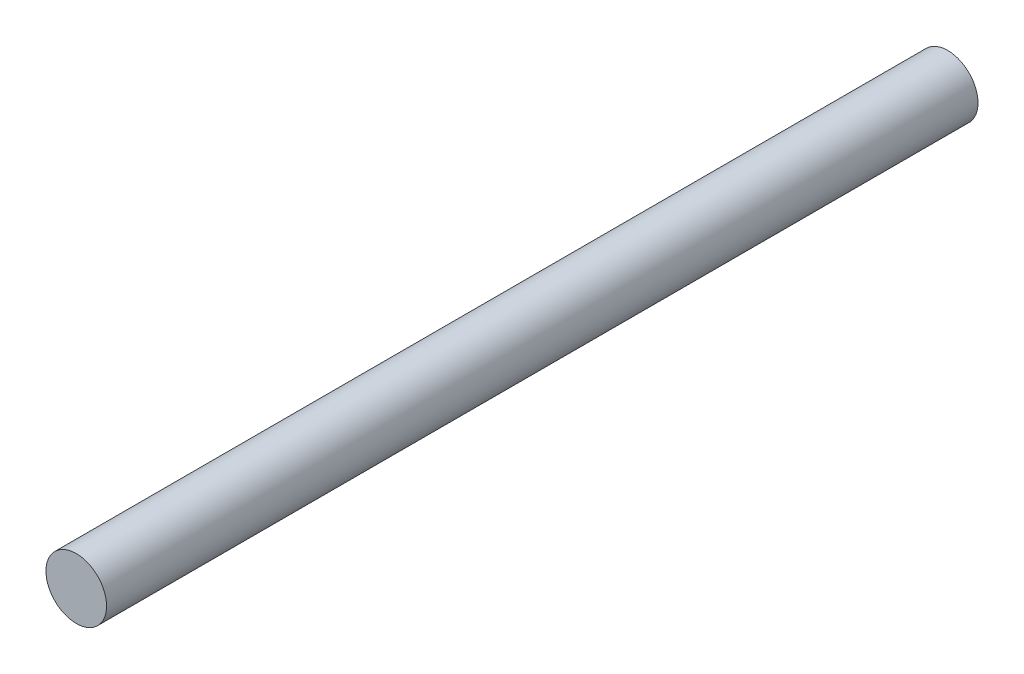
ISO-10303-21;
HEADER;
FILE_DESCRIPTION(('STEP AP214'),'2;1');
FILE_NAME('part.step','',(''),(''),'','','');
FILE_SCHEMA(('AUTOMOTIVE_DESIGN { 1 0 10303 214 1 1 1 1 }'));
ENDSEC;
DATA;
#1=APPLICATION_CONTEXT('core data for automotive mechanical design processes');
#2=APPLICATION_PROTOCOL_DEFINITION('international standard','automotive_design',2000,#1);
#3=PRODUCT_CONTEXT('',#1,'mechanical');
#4=PRODUCT('Part','Part','',(#3));
#5=PRODUCT_RELATED_PRODUCT_CATEGORY('part','',(#4));
#6=PRODUCT_DEFINITION_FORMATION('','',#4);
#7=PRODUCT_DEFINITION_CONTEXT('part definition',#1,'design');
#8=PRODUCT_DEFINITION('design','',#6,#7);
#9=PRODUCT_DEFINITION_SHAPE('','',#8);
#10=(LENGTH_UNIT() NAMED_UNIT(*) SI_UNIT(.MILLI.,.METRE.));
#11=(NAMED_UNIT(*) PLANE_ANGLE_UNIT() SI_UNIT($,.RADIAN.));
#12=(NAMED_UNIT(*) SI_UNIT($,.STERADIAN.) SOLID_ANGLE_UNIT());
#13=UNCERTAINTY_MEASURE_WITH_UNIT(LENGTH_MEASURE(1.E-05),#10,'distance_accuracy_value','');
#14=(GEOMETRIC_REPRESENTATION_CONTEXT(3) GLOBAL_UNCERTAINTY_ASSIGNED_CONTEXT((#13)) GLOBAL_UNIT_ASSIGNED_CONTEXT((#10,
#11,#12)) REPRESENTATION_CONTEXT('',''));
#15=CARTESIAN_POINT('',(0.,0.,0.));
#16=DIRECTION('',(0.,0.,1.));
#17=DIRECTION('',(1.,0.,0.));
#18=AXIS2_PLACEMENT_3D('',#15,#16,#17);
#19=CARTESIAN_POINT('',(0.,0.,115.));
#20=DIRECTION('',(0.,0.,-1.));
#21=DIRECTION('',(-1.,0.,0.));
#22=AXIS2_PLACEMENT_3D('',#19,#20,#21);
#23=CYLINDRICAL_SURFACE('',#22,4.);
#24=CARTESIAN_POINT('',(0.,0.,115.));
#25=DIRECTION('',(0.,0.,1.));
#26=DIRECTION('',(1.,0.,0.));
#27=AXIS2_PLACEMENT_3D('',#24,#25,#26);
#28=CIRCLE('',#27,4.);
#29=CARTESIAN_POINT('',(4.,0.,115.));
#30=VERTEX_POINT('',#29);
#31=EDGE_CURVE('E10',#30,#30,#28,.T.);
#32=ORIENTED_EDGE('',*,*,#31,.F.);
#33=EDGE_LOOP('',(#32));
#34=FACE_BOUND('',#33,.T.);
#35=CARTESIAN_POINT('',(0.,0.,0.));
#36=DIRECTION('',(0.,0.,1.));
#37=DIRECTION('',(1.,0.,0.));
#38=AXIS2_PLACEMENT_3D('',#35,#36,#37);
#39=CIRCLE('',#38,4.);
#40=CARTESIAN_POINT('',(4.,0.,0.));
#41=VERTEX_POINT('',#40);
#42=EDGE_CURVE('E33',#41,#41,#39,.T.);
#43=ORIENTED_EDGE('',*,*,#42,.T.);
#44=EDGE_LOOP('',(#43));
#45=FACE_BOUND('',#44,.T.);
#46=ADVANCED_FACE('F30',(#34,#45),#23,.T.);
#47=CARTESIAN_POINT('',(0.,0.,115.));
#48=DIRECTION('',(0.,0.,1.));
#49=DIRECTION('',(1.,0.,0.));
#50=AXIS2_PLACEMENT_3D('',#47,#48,#49);
#51=PLANE('',#50);
#52=ORIENTED_EDGE('',*,*,#31,.T.);
#53=EDGE_LOOP('',(#52));
#54=FACE_BOUND('',#53,.T.);
#55=ADVANCED_FACE('F45',(#54),#51,.T.);
#56=CARTESIAN_POINT('',(0.,0.,0.));
#57=DIRECTION('',(0.,0.,1.));
#58=DIRECTION('',(1.,0.,0.));
#59=AXIS2_PLACEMENT_3D('',#56,#57,#58);
#60=PLANE('',#59);
#61=ORIENTED_EDGE('',*,*,#42,.F.);
#62=EDGE_LOOP('',(#61));
#63=FACE_BOUND('',#62,.T.);
#64=ADVANCED_FACE('F43',(#63),#60,.F.);
#65=CLOSED_SHELL('',(#46,#55,#64));
#66=MANIFOLD_SOLID_BREP('B2',#65);
#67=ADVANCED_BREP_SHAPE_REPRESENTATION('',(#18,#66),#14);
#68=SHAPE_DEFINITION_REPRESENTATION(#9,#67);
ENDSEC;
END-ISO-10303-21;
